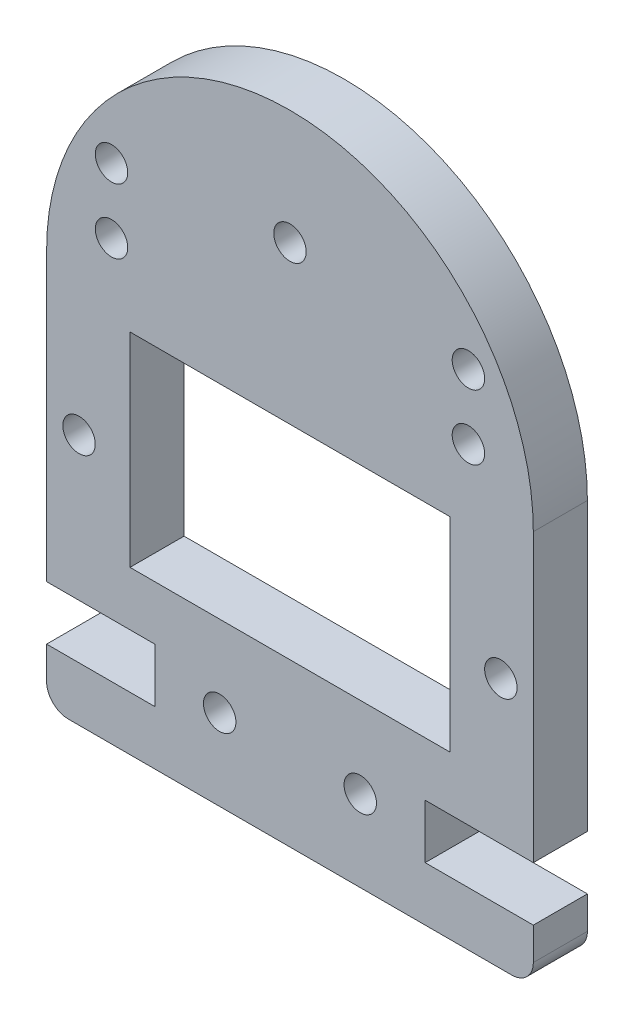
ISO-10303-21;
HEADER;
FILE_DESCRIPTION(('STEP AP214'),'2;1');
FILE_NAME('part.step','',(''),(''),'','','');
FILE_SCHEMA(('AUTOMOTIVE_DESIGN { 1 0 10303 214 1 1 1 1 }'));
ENDSEC;
DATA;
#1=APPLICATION_CONTEXT('core data for automotive mechanical design processes');
#2=APPLICATION_PROTOCOL_DEFINITION('international standard','automotive_design',2000,#1);
#3=PRODUCT_CONTEXT('',#1,'mechanical');
#4=PRODUCT('Part','Part','',(#3));
#5=PRODUCT_RELATED_PRODUCT_CATEGORY('part','',(#4));
#6=PRODUCT_DEFINITION_FORMATION('','',#4);
#7=PRODUCT_DEFINITION_CONTEXT('part definition',#1,'design');
#8=PRODUCT_DEFINITION('design','',#6,#7);
#9=PRODUCT_DEFINITION_SHAPE('','',#8);
#10=(LENGTH_UNIT() NAMED_UNIT(*) SI_UNIT(.MILLI.,.METRE.));
#11=(NAMED_UNIT(*) PLANE_ANGLE_UNIT() SI_UNIT($,.RADIAN.));
#12=(NAMED_UNIT(*) SI_UNIT($,.STERADIAN.) SOLID_ANGLE_UNIT());
#13=UNCERTAINTY_MEASURE_WITH_UNIT(LENGTH_MEASURE(1.E-05),#10,'distance_accuracy_value','');
#14=(GEOMETRIC_REPRESENTATION_CONTEXT(3) GLOBAL_UNCERTAINTY_ASSIGNED_CONTEXT((#13)) GLOBAL_UNIT_ASSIGNED_CONTEXT((#10,
#11,#12)) REPRESENTATION_CONTEXT('',''));
#15=CARTESIAN_POINT('',(0.,0.,0.));
#16=DIRECTION('',(0.,0.,1.));
#17=DIRECTION('',(1.,0.,0.));
#18=AXIS2_PLACEMENT_3D('',#15,#16,#17);
#19=CARTESIAN_POINT('',(-1.76634170575383,13.25,5.));
#20=DIRECTION('',(0.,0.,-1.));
#21=DIRECTION('',(-1.,0.,0.));
#22=AXIS2_PLACEMENT_3D('',#19,#20,#21);
#23=CYLINDRICAL_SURFACE('',#22,22.5);
#24=CARTESIAN_POINT('',(-1.76634170575383,13.25,0.));
#25=DIRECTION('',(0.,0.,1.));
#26=DIRECTION('',(1.,0.,0.));
#27=AXIS2_PLACEMENT_3D('',#24,#25,#26);
#28=CIRCLE('',#27,22.5);
#29=CARTESIAN_POINT('',(20.7336582942462,13.25,0.));
#30=VERTEX_POINT('',#29);
#31=CARTESIAN_POINT('',(-24.2663417057538,13.25,0.));
#32=VERTEX_POINT('',#31);
#33=EDGE_CURVE('E198',#30,#32,#28,.T.);
#34=ORIENTED_EDGE('',*,*,#33,.T.);
#35=DIRECTION('',(0.,0.,-1.));
#36=VECTOR('',#35,1.);
#37=CARTESIAN_POINT('',(-24.2663417057538,13.25,5.));
#38=LINE('',#37,#36);
#39=CARTESIAN_POINT('',(-24.2663417057538,13.25,5.));
#40=VERTEX_POINT('',#39);
#41=EDGE_CURVE('E11',#40,#32,#38,.T.);
#42=ORIENTED_EDGE('',*,*,#41,.F.);
#43=CARTESIAN_POINT('',(-1.76634170575383,13.25,5.));
#44=DIRECTION('',(0.,0.,1.));
#45=DIRECTION('',(1.,0.,0.));
#46=AXIS2_PLACEMENT_3D('',#43,#44,#45);
#47=CIRCLE('',#46,22.5);
#48=CARTESIAN_POINT('',(20.7336582942462,13.25,5.));
#49=VERTEX_POINT('',#48);
#50=EDGE_CURVE('E202',#49,#40,#47,.T.);
#51=ORIENTED_EDGE('',*,*,#50,.F.);
#52=DIRECTION('',(0.,0.,-1.));
#53=VECTOR('',#52,1.);
#54=CARTESIAN_POINT('',(20.7336582942462,13.25,5.));
#55=LINE('',#54,#53);
#56=EDGE_CURVE('E232',#49,#30,#55,.T.);
#57=ORIENTED_EDGE('',*,*,#56,.T.);
#58=EDGE_LOOP('',(#34,#42,#51,#57));
#59=FACE_BOUND('',#58,.T.);
#60=ADVANCED_FACE('F35',(#59),#23,.T.);
#61=CARTESIAN_POINT('',(-24.2663417057538,-13.25,5.));
#62=DIRECTION('',(1.,0.,0.));
#63=DIRECTION('',(0.,0.,-1.));
#64=AXIS2_PLACEMENT_3D('',#61,#62,#63);
#65=PLANE('',#64);
#66=DIRECTION('',(0.,-1.,0.));
#67=VECTOR('',#66,1.);
#68=CARTESIAN_POINT('',(-24.2663417057538,-13.25,0.));
#69=LINE('',#68,#67);
#70=CARTESIAN_POINT('',(-24.2663417057538,-13.25,0.));
#71=VERTEX_POINT('',#70);
#72=EDGE_CURVE('E235',#32,#71,#69,.T.);
#73=ORIENTED_EDGE('',*,*,#72,.T.);
#74=DIRECTION('',(0.,0.,-1.));
#75=VECTOR('',#74,1.);
#76=CARTESIAN_POINT('',(-24.2663417057538,-13.25,5.));
#77=LINE('',#76,#75);
#78=CARTESIAN_POINT('',(-24.2663417057538,-13.25,5.));
#79=VERTEX_POINT('',#78);
#80=EDGE_CURVE('E43',#79,#71,#77,.T.);
#81=ORIENTED_EDGE('',*,*,#80,.F.);
#82=DIRECTION('',(0.,-1.,0.));
#83=VECTOR('',#82,1.);
#84=CARTESIAN_POINT('',(-24.2663417057538,-3.25,5.));
#85=LINE('',#84,#83);
#86=EDGE_CURVE('E205',#40,#79,#85,.T.);
#87=ORIENTED_EDGE('',*,*,#86,.F.);
#88=ORIENTED_EDGE('',*,*,#41,.T.);
#89=EDGE_LOOP('',(#73,#81,#87,#88));
#90=FACE_BOUND('',#89,.T.);
#91=ADVANCED_FACE('F422',(#90),#65,.F.);
#92=CARTESIAN_POINT('',(-14.2663417057538,-13.25,5.));
#93=DIRECTION('',(0.,1.,0.));
#94=DIRECTION('',(0.,0.,1.));
#95=AXIS2_PLACEMENT_3D('',#92,#93,#94);
#96=PLANE('',#95);
#97=DIRECTION('',(1.,0.,0.));
#98=VECTOR('',#97,1.);
#99=CARTESIAN_POINT('',(-14.2663417057538,-13.25,0.));
#100=LINE('',#99,#98);
#101=CARTESIAN_POINT('',(-14.2663417057538,-13.25,0.));
#102=VERTEX_POINT('',#101);
#103=EDGE_CURVE('E237',#71,#102,#100,.T.);
#104=ORIENTED_EDGE('',*,*,#103,.T.);
#105=DIRECTION('',(0.,0.,-1.));
#106=VECTOR('',#105,1.);
#107=CARTESIAN_POINT('',(-14.2663417057538,-13.25,5.));
#108=LINE('',#107,#106);
#109=CARTESIAN_POINT('',(-14.2663417057538,-13.25,5.));
#110=VERTEX_POINT('',#109);
#111=EDGE_CURVE('E293',#110,#102,#108,.T.);
#112=ORIENTED_EDGE('',*,*,#111,.F.);
#113=DIRECTION('',(1.,0.,0.));
#114=VECTOR('',#113,1.);
#115=CARTESIAN_POINT('',(-14.2663417057538,-13.25,5.));
#116=LINE('',#115,#114);
#117=EDGE_CURVE('E208',#79,#110,#116,.T.);
#118=ORIENTED_EDGE('',*,*,#117,.F.);
#119=ORIENTED_EDGE('',*,*,#80,.T.);
#120=EDGE_LOOP('',(#104,#112,#118,#119));
#121=FACE_BOUND('',#120,.T.);
#122=ADVANCED_FACE('F418',(#121),#96,.F.);
#123=CARTESIAN_POINT('',(-14.2663417057538,-13.25,5.));
#124=DIRECTION('',(1.,0.,0.));
#125=DIRECTION('',(0.,0.,-1.));
#126=AXIS2_PLACEMENT_3D('',#123,#124,#125);
#127=PLANE('',#126);
#128=DIRECTION('',(0.,-1.,0.));
#129=VECTOR('',#128,1.);
#130=CARTESIAN_POINT('',(-14.2663417057538,-13.25,0.));
#131=LINE('',#130,#129);
#132=CARTESIAN_POINT('',(-14.2663417057538,-18.25,0.));
#133=VERTEX_POINT('',#132);
#134=EDGE_CURVE('E239',#102,#133,#131,.T.);
#135=ORIENTED_EDGE('',*,*,#134,.T.);
#136=DIRECTION('',(0.,0.,-1.));
#137=VECTOR('',#136,1.);
#138=CARTESIAN_POINT('',(-14.2663417057538,-18.25,5.));
#139=LINE('',#138,#137);
#140=CARTESIAN_POINT('',(-14.2663417057538,-18.25,5.));
#141=VERTEX_POINT('',#140);
#142=EDGE_CURVE('E290',#141,#133,#139,.T.);
#143=ORIENTED_EDGE('',*,*,#142,.F.);
#144=DIRECTION('',(0.,-1.,0.));
#145=VECTOR('',#144,1.);
#146=CARTESIAN_POINT('',(-14.2663417057538,-13.25,5.));
#147=LINE('',#146,#145);
#148=EDGE_CURVE('E210',#110,#141,#147,.T.);
#149=ORIENTED_EDGE('',*,*,#148,.F.);
#150=ORIENTED_EDGE('',*,*,#111,.T.);
#151=EDGE_LOOP('',(#135,#143,#149,#150));
#152=FACE_BOUND('',#151,.T.);
#153=ADVANCED_FACE('F415',(#152),#127,.F.);
#154=CARTESIAN_POINT('',(-14.2663417057538,-18.25,5.));
#155=DIRECTION('',(0.,-1.,0.));
#156=DIRECTION('',(0.,0.,-1.));
#157=AXIS2_PLACEMENT_3D('',#154,#155,#156);
#158=PLANE('',#157);
#159=DIRECTION('',(-1.,0.,0.));
#160=VECTOR('',#159,1.);
#161=CARTESIAN_POINT('',(-14.2663417057538,-18.25,0.));
#162=LINE('',#161,#160);
#163=CARTESIAN_POINT('',(-24.2663417057538,-18.25,0.));
#164=VERTEX_POINT('',#163);
#165=EDGE_CURVE('E241',#133,#164,#162,.T.);
#166=ORIENTED_EDGE('',*,*,#165,.T.);
#167=DIRECTION('',(0.,0.,-1.));
#168=VECTOR('',#167,1.);
#169=CARTESIAN_POINT('',(-24.2663417057538,-18.25,5.));
#170=LINE('',#169,#168);
#171=CARTESIAN_POINT('',(-24.2663417057538,-18.25,5.));
#172=VERTEX_POINT('',#171);
#173=EDGE_CURVE('E287',#172,#164,#170,.T.);
#174=ORIENTED_EDGE('',*,*,#173,.F.);
#175=DIRECTION('',(-1.,0.,0.));
#176=VECTOR('',#175,1.);
#177=CARTESIAN_POINT('',(-14.2663417057538,-18.25,5.));
#178=LINE('',#177,#176);
#179=EDGE_CURVE('E212',#141,#172,#178,.T.);
#180=ORIENTED_EDGE('',*,*,#179,.F.);
#181=ORIENTED_EDGE('',*,*,#142,.T.);
#182=EDGE_LOOP('',(#166,#174,#180,#181));
#183=FACE_BOUND('',#182,.T.);
#184=ADVANCED_FACE('F411',(#183),#158,.F.);
#185=CARTESIAN_POINT('',(-24.2663417057538,-18.25,5.));
#186=DIRECTION('',(1.,0.,0.));
#187=DIRECTION('',(0.,0.,-1.));
#188=AXIS2_PLACEMENT_3D('',#185,#186,#187);
#189=PLANE('',#188);
#190=DIRECTION('',(0.,-1.,0.));
#191=VECTOR('',#190,1.);
#192=CARTESIAN_POINT('',(-24.2663417057538,-18.25,0.));
#193=LINE('',#192,#191);
#194=CARTESIAN_POINT('',(-24.2663417057538,-21.25,0.));
#195=VERTEX_POINT('',#194);
#196=EDGE_CURVE('E243',#164,#195,#193,.T.);
#197=ORIENTED_EDGE('',*,*,#196,.T.);
#198=DIRECTION('',(0.,0.,-1.));
#199=VECTOR('',#198,1.);
#200=CARTESIAN_POINT('',(-24.2663417057538,-21.25,5.));
#201=LINE('',#200,#199);
#202=CARTESIAN_POINT('',(-24.2663417057538,-21.25,5.));
#203=VERTEX_POINT('',#202);
#204=EDGE_CURVE('E284',#203,#195,#201,.T.);
#205=ORIENTED_EDGE('',*,*,#204,.F.);
#206=DIRECTION('',(0.,-1.,0.));
#207=VECTOR('',#206,1.);
#208=CARTESIAN_POINT('',(-24.2663417057538,-18.25,5.));
#209=LINE('',#208,#207);
#210=EDGE_CURVE('E214',#172,#203,#209,.T.);
#211=ORIENTED_EDGE('',*,*,#210,.F.);
#212=ORIENTED_EDGE('',*,*,#173,.T.);
#213=EDGE_LOOP('',(#197,#205,#211,#212));
#214=FACE_BOUND('',#213,.T.);
#215=ADVANCED_FACE('F406',(#214),#189,.F.);
#216=CARTESIAN_POINT('',(-22.2663417057538,-21.25,5.));
#217=DIRECTION('',(0.,0.,-1.));
#218=DIRECTION('',(-1.,0.,0.));
#219=AXIS2_PLACEMENT_3D('',#216,#217,#218);
#220=CYLINDRICAL_SURFACE('',#219,2.);
#221=CARTESIAN_POINT('',(-22.2663417057538,-21.25,0.));
#222=DIRECTION('',(0.,0.,1.));
#223=DIRECTION('',(1.,0.,0.));
#224=AXIS2_PLACEMENT_3D('',#221,#222,#223);
#225=CIRCLE('',#224,2.);
#226=CARTESIAN_POINT('',(-22.2663417057538,-23.25,0.));
#227=VERTEX_POINT('',#226);
#228=EDGE_CURVE('E245',#195,#227,#225,.T.);
#229=ORIENTED_EDGE('',*,*,#228,.T.);
#230=DIRECTION('',(0.,0.,-1.));
#231=VECTOR('',#230,1.);
#232=CARTESIAN_POINT('',(-22.2663417057538,-23.25,5.));
#233=LINE('',#232,#231);
#234=CARTESIAN_POINT('',(-22.2663417057538,-23.25,5.));
#235=VERTEX_POINT('',#234);
#236=EDGE_CURVE('E281',#235,#227,#233,.T.);
#237=ORIENTED_EDGE('',*,*,#236,.F.);
#238=CARTESIAN_POINT('',(-22.2663417057538,-21.25,5.));
#239=DIRECTION('',(0.,0.,1.));
#240=DIRECTION('',(1.,0.,0.));
#241=AXIS2_PLACEMENT_3D('',#238,#239,#240);
#242=CIRCLE('',#241,2.);
#243=EDGE_CURVE('E216',#203,#235,#242,.T.);
#244=ORIENTED_EDGE('',*,*,#243,.F.);
#245=ORIENTED_EDGE('',*,*,#204,.T.);
#246=EDGE_LOOP('',(#229,#237,#244,#245));
#247=FACE_BOUND('',#246,.T.);
#248=ADVANCED_FACE('F400',(#247),#220,.T.);
#249=CARTESIAN_POINT('',(18.7336582942462,-23.25,5.));
#250=DIRECTION('',(0.,1.,0.));
#251=DIRECTION('',(0.,0.,1.));
#252=AXIS2_PLACEMENT_3D('',#249,#250,#251);
#253=PLANE('',#252);
#254=DIRECTION('',(1.,0.,0.));
#255=VECTOR('',#254,1.);
#256=CARTESIAN_POINT('',(18.7336582942462,-23.25,0.));
#257=LINE('',#256,#255);
#258=CARTESIAN_POINT('',(18.7336582942462,-23.25,0.));
#259=VERTEX_POINT('',#258);
#260=EDGE_CURVE('E247',#227,#259,#257,.T.);
#261=ORIENTED_EDGE('',*,*,#260,.T.);
#262=DIRECTION('',(0.,0.,-1.));
#263=VECTOR('',#262,1.);
#264=CARTESIAN_POINT('',(18.7336582942462,-23.25,5.));
#265=LINE('',#264,#263);
#266=CARTESIAN_POINT('',(18.7336582942462,-23.25,5.));
#267=VERTEX_POINT('',#266);
#268=EDGE_CURVE('E278',#267,#259,#265,.T.);
#269=ORIENTED_EDGE('',*,*,#268,.F.);
#270=DIRECTION('',(1.,0.,0.));
#271=VECTOR('',#270,1.);
#272=CARTESIAN_POINT('',(18.7336582942462,-23.25,5.));
#273=LINE('',#272,#271);
#274=EDGE_CURVE('E218',#235,#267,#273,.T.);
#275=ORIENTED_EDGE('',*,*,#274,.F.);
#276=ORIENTED_EDGE('',*,*,#236,.T.);
#277=EDGE_LOOP('',(#261,#269,#275,#276));
#278=FACE_BOUND('',#277,.T.);
#279=ADVANCED_FACE('F396',(#278),#253,.F.);
#280=CARTESIAN_POINT('',(18.7336582942462,-21.25,5.));
#281=DIRECTION('',(0.,0.,-1.));
#282=DIRECTION('',(-1.,0.,0.));
#283=AXIS2_PLACEMENT_3D('',#280,#281,#282);
#284=CYLINDRICAL_SURFACE('',#283,2.);
#285=CARTESIAN_POINT('',(18.7336582942462,-21.25,0.));
#286=DIRECTION('',(0.,0.,1.));
#287=DIRECTION('',(1.,0.,0.));
#288=AXIS2_PLACEMENT_3D('',#285,#286,#287);
#289=CIRCLE('',#288,2.);
#290=CARTESIAN_POINT('',(20.7336582942462,-21.25,0.));
#291=VERTEX_POINT('',#290);
#292=EDGE_CURVE('E249',#259,#291,#289,.T.);
#293=ORIENTED_EDGE('',*,*,#292,.T.);
#294=DIRECTION('',(0.,0.,-1.));
#295=VECTOR('',#294,1.);
#296=CARTESIAN_POINT('',(20.7336582942462,-21.25,5.));
#297=LINE('',#296,#295);
#298=CARTESIAN_POINT('',(20.7336582942462,-21.25,5.));
#299=VERTEX_POINT('',#298);
#300=EDGE_CURVE('E275',#299,#291,#297,.T.);
#301=ORIENTED_EDGE('',*,*,#300,.F.);
#302=CARTESIAN_POINT('',(18.7336582942462,-21.25,5.));
#303=DIRECTION('',(0.,0.,1.));
#304=DIRECTION('',(1.,0.,0.));
#305=AXIS2_PLACEMENT_3D('',#302,#303,#304);
#306=CIRCLE('',#305,2.);
#307=EDGE_CURVE('E220',#267,#299,#306,.T.);
#308=ORIENTED_EDGE('',*,*,#307,.F.);
#309=ORIENTED_EDGE('',*,*,#268,.T.);
#310=EDGE_LOOP('',(#293,#301,#308,#309));
#311=FACE_BOUND('',#310,.T.);
#312=ADVANCED_FACE('F391',(#311),#284,.T.);
#313=CARTESIAN_POINT('',(20.7336582942462,-18.25,5.));
#314=DIRECTION('',(-1.,0.,0.));
#315=DIRECTION('',(0.,0.,1.));
#316=AXIS2_PLACEMENT_3D('',#313,#314,#315);
#317=PLANE('',#316);
#318=DIRECTION('',(0.,1.,0.));
#319=VECTOR('',#318,1.);
#320=CARTESIAN_POINT('',(20.7336582942462,-18.25,0.));
#321=LINE('',#320,#319);
#322=CARTESIAN_POINT('',(20.7336582942462,-18.25,0.));
#323=VERTEX_POINT('',#322);
#324=EDGE_CURVE('E251',#291,#323,#321,.T.);
#325=ORIENTED_EDGE('',*,*,#324,.T.);
#326=DIRECTION('',(0.,0.,-1.));
#327=VECTOR('',#326,1.);
#328=CARTESIAN_POINT('',(20.7336582942462,-18.25,5.));
#329=LINE('',#328,#327);
#330=CARTESIAN_POINT('',(20.7336582942462,-18.25,5.));
#331=VERTEX_POINT('',#330);
#332=EDGE_CURVE('E272',#331,#323,#329,.T.);
#333=ORIENTED_EDGE('',*,*,#332,.F.);
#334=DIRECTION('',(0.,1.,0.));
#335=VECTOR('',#334,1.);
#336=CARTESIAN_POINT('',(20.7336582942462,-18.25,5.));
#337=LINE('',#336,#335);
#338=EDGE_CURVE('E222',#299,#331,#337,.T.);
#339=ORIENTED_EDGE('',*,*,#338,.F.);
#340=ORIENTED_EDGE('',*,*,#300,.T.);
#341=EDGE_LOOP('',(#325,#333,#339,#340));
#342=FACE_BOUND('',#341,.T.);
#343=ADVANCED_FACE('F385',(#342),#317,.F.);
#344=CARTESIAN_POINT('',(10.7336582942462,-18.25,5.));
#345=DIRECTION('',(0.,-1.,0.));
#346=DIRECTION('',(0.,0.,-1.));
#347=AXIS2_PLACEMENT_3D('',#344,#345,#346);
#348=PLANE('',#347);
#349=DIRECTION('',(-1.,0.,0.));
#350=VECTOR('',#349,1.);
#351=CARTESIAN_POINT('',(10.7336582942462,-18.25,0.));
#352=LINE('',#351,#350);
#353=CARTESIAN_POINT('',(10.7336582942462,-18.25,0.));
#354=VERTEX_POINT('',#353);
#355=EDGE_CURVE('E253',#323,#354,#352,.T.);
#356=ORIENTED_EDGE('',*,*,#355,.T.);
#357=DIRECTION('',(0.,0.,-1.));
#358=VECTOR('',#357,1.);
#359=CARTESIAN_POINT('',(10.7336582942462,-18.25,5.));
#360=LINE('',#359,#358);
#361=CARTESIAN_POINT('',(10.7336582942462,-18.25,5.));
#362=VERTEX_POINT('',#361);
#363=EDGE_CURVE('E269',#362,#354,#360,.T.);
#364=ORIENTED_EDGE('',*,*,#363,.F.);
#365=DIRECTION('',(-1.,0.,0.));
#366=VECTOR('',#365,1.);
#367=CARTESIAN_POINT('',(10.7336582942462,-18.25,5.));
#368=LINE('',#367,#366);
#369=EDGE_CURVE('E224',#331,#362,#368,.T.);
#370=ORIENTED_EDGE('',*,*,#369,.F.);
#371=ORIENTED_EDGE('',*,*,#332,.T.);
#372=EDGE_LOOP('',(#356,#364,#370,#371));
#373=FACE_BOUND('',#372,.T.);
#374=ADVANCED_FACE('F381',(#373),#348,.F.);
#375=CARTESIAN_POINT('',(10.7336582942462,-13.25,5.));
#376=DIRECTION('',(-1.,0.,0.));
#377=DIRECTION('',(0.,-1.,0.));
#378=AXIS2_PLACEMENT_3D('',#375,#376,#377);
#379=PLANE('',#378);
#380=DIRECTION('',(0.,1.,0.));
#381=VECTOR('',#380,1.);
#382=CARTESIAN_POINT('',(10.7336582942462,-13.25,0.));
#383=LINE('',#382,#381);
#384=CARTESIAN_POINT('',(10.7336582942462,-13.25,0.));
#385=VERTEX_POINT('',#384);
#386=EDGE_CURVE('E255',#354,#385,#383,.T.);
#387=ORIENTED_EDGE('',*,*,#386,.T.);
#388=DIRECTION('',(0.,0.,-1.));
#389=VECTOR('',#388,1.);
#390=CARTESIAN_POINT('',(10.7336582942462,-13.25,5.));
#391=LINE('',#390,#389);
#392=CARTESIAN_POINT('',(10.7336582942462,-13.25,5.));
#393=VERTEX_POINT('',#392);
#394=EDGE_CURVE('E266',#393,#385,#391,.T.);
#395=ORIENTED_EDGE('',*,*,#394,.F.);
#396=DIRECTION('',(0.,1.,0.));
#397=VECTOR('',#396,1.);
#398=CARTESIAN_POINT('',(10.7336582942462,-13.25,5.));
#399=LINE('',#398,#397);
#400=EDGE_CURVE('E226',#362,#393,#399,.T.);
#401=ORIENTED_EDGE('',*,*,#400,.F.);
#402=ORIENTED_EDGE('',*,*,#363,.T.);
#403=EDGE_LOOP('',(#387,#395,#401,#402));
#404=FACE_BOUND('',#403,.T.);
#405=ADVANCED_FACE('F376',(#404),#379,.F.);
#406=CARTESIAN_POINT('',(10.7336582942462,-13.25,5.));
#407=DIRECTION('',(0.,1.,0.));
#408=DIRECTION('',(0.,0.,1.));
#409=AXIS2_PLACEMENT_3D('',#406,#407,#408);
#410=PLANE('',#409);
#411=DIRECTION('',(1.,0.,0.));
#412=VECTOR('',#411,1.);
#413=CARTESIAN_POINT('',(10.7336582942462,-13.25,0.));
#414=LINE('',#413,#412);
#415=CARTESIAN_POINT('',(20.7336582942462,-13.25,0.));
#416=VERTEX_POINT('',#415);
#417=EDGE_CURVE('E257',#385,#416,#414,.T.);
#418=ORIENTED_EDGE('',*,*,#417,.T.);
#419=DIRECTION('',(0.,0.,-1.));
#420=VECTOR('',#419,1.);
#421=CARTESIAN_POINT('',(20.7336582942462,-13.25,5.));
#422=LINE('',#421,#420);
#423=CARTESIAN_POINT('',(20.7336582942462,-13.25,5.));
#424=VERTEX_POINT('',#423);
#425=EDGE_CURVE('E263',#424,#416,#422,.T.);
#426=ORIENTED_EDGE('',*,*,#425,.F.);
#427=DIRECTION('',(1.,0.,0.));
#428=VECTOR('',#427,1.);
#429=CARTESIAN_POINT('',(10.7336582942462,-13.25,5.));
#430=LINE('',#429,#428);
#431=EDGE_CURVE('E228',#393,#424,#430,.T.);
#432=ORIENTED_EDGE('',*,*,#431,.F.);
#433=ORIENTED_EDGE('',*,*,#394,.T.);
#434=EDGE_LOOP('',(#418,#426,#432,#433));
#435=FACE_BOUND('',#434,.T.);
#436=ADVANCED_FACE('F370',(#435),#410,.F.);
#437=CARTESIAN_POINT('',(20.7336582942462,-3.22226862184038,5.));
#438=DIRECTION('',(-1.,0.,0.));
#439=DIRECTION('',(0.,0.,1.));
#440=AXIS2_PLACEMENT_3D('',#437,#438,#439);
#441=PLANE('',#440);
#442=DIRECTION('',(0.,1.,0.));
#443=VECTOR('',#442,1.);
#444=CARTESIAN_POINT('',(20.7336582942462,-3.22226862184038,0.));
#445=LINE('',#444,#443);
#446=EDGE_CURVE('E206',#416,#30,#445,.T.);
#447=ORIENTED_EDGE('',*,*,#446,.T.);
#448=ORIENTED_EDGE('',*,*,#56,.F.);
#449=DIRECTION('',(0.,1.,0.));
#450=VECTOR('',#449,1.);
#451=CARTESIAN_POINT('',(20.7336582942462,-13.25,5.));
#452=LINE('',#451,#450);
#453=EDGE_CURVE('E230',#424,#49,#452,.T.);
#454=ORIENTED_EDGE('',*,*,#453,.F.);
#455=ORIENTED_EDGE('',*,*,#425,.T.);
#456=EDGE_LOOP('',(#447,#448,#454,#455));
#457=FACE_BOUND('',#456,.T.);
#458=ADVANCED_FACE('F366',(#457),#441,.F.);
#459=CARTESIAN_POINT('',(-1.76634170575383,13.25,5.));
#460=DIRECTION('',(0.,0.,1.));
#461=DIRECTION('',(1.,0.,0.));
#462=AXIS2_PLACEMENT_3D('',#459,#460,#461);
#463=PLANE('',#462);
#464=CARTESIAN_POINT('',(14.7336582942462,23.25,5.));
#465=DIRECTION('',(0.,0.,1.));
#466=DIRECTION('',(1.,0.,0.));
#467=AXIS2_PLACEMENT_3D('',#464,#465,#466);
#468=CIRCLE('',#467,1.5);
#469=CARTESIAN_POINT('',(16.2336582942462,23.25,5.));
#470=VERTEX_POINT('',#469);
#471=EDGE_CURVE('E318',#470,#470,#468,.T.);
#472=ORIENTED_EDGE('',*,*,#471,.F.);
#473=EDGE_LOOP('',(#472));
#474=FACE_BOUND('',#473,.T.);
#475=CARTESIAN_POINT('',(-18.2663417057538,23.25,5.));
#476=DIRECTION('',(0.,0.,1.));
#477=DIRECTION('',(1.,0.,0.));
#478=AXIS2_PLACEMENT_3D('',#475,#476,#477);
#479=CIRCLE('',#478,1.5);
#480=CARTESIAN_POINT('',(-16.7663417057538,23.25,5.));
#481=VERTEX_POINT('',#480);
#482=EDGE_CURVE('E608',#481,#481,#479,.T.);
#483=ORIENTED_EDGE('',*,*,#482,.F.);
#484=EDGE_LOOP('',(#483));
#485=FACE_BOUND('',#484,.T.);
#486=CARTESIAN_POINT('',(-18.2663417057538,17.25,5.));
#487=DIRECTION('',(0.,0.,1.));
#488=DIRECTION('',(1.,0.,0.));
#489=AXIS2_PLACEMENT_3D('',#486,#487,#488);
#490=CIRCLE('',#489,1.5);
#491=CARTESIAN_POINT('',(-16.7663417057538,17.25,5.));
#492=VERTEX_POINT('',#491);
#493=EDGE_CURVE('E331',#492,#492,#490,.T.);
#494=ORIENTED_EDGE('',*,*,#493,.F.);
#495=EDGE_LOOP('',(#494));
#496=FACE_BOUND('',#495,.T.);
#497=CARTESIAN_POINT('',(14.7336582942462,17.25,5.));
#498=DIRECTION('',(0.,0.,1.));
#499=DIRECTION('',(1.,0.,0.));
#500=AXIS2_PLACEMENT_3D('',#497,#498,#499);
#501=CIRCLE('',#500,1.5);
#502=CARTESIAN_POINT('',(16.2336582942462,17.25,5.));
#503=VERTEX_POINT('',#502);
#504=EDGE_CURVE('E314',#503,#503,#501,.T.);
#505=ORIENTED_EDGE('',*,*,#504,.F.);
#506=EDGE_LOOP('',(#505));
#507=FACE_BOUND('',#506,.T.);
#508=CARTESIAN_POINT('',(-1.76634170575383,25.15,5.));
#509=DIRECTION('',(0.,0.,1.));
#510=DIRECTION('',(1.,0.,0.));
#511=AXIS2_PLACEMENT_3D('',#508,#509,#510);
#512=CIRCLE('',#511,1.5);
#513=CARTESIAN_POINT('',(-0.266341705753831,25.15,5.));
#514=VERTEX_POINT('',#513);
#515=EDGE_CURVE('E310',#514,#514,#512,.T.);
#516=ORIENTED_EDGE('',*,*,#515,.F.);
#517=EDGE_LOOP('',(#516));
#518=FACE_BOUND('',#517,.T.);
#519=CARTESIAN_POINT('',(-8.26634170575383,-15.75,5.));
#520=DIRECTION('',(0.,0.,1.));
#521=DIRECTION('',(1.,0.,0.));
#522=AXIS2_PLACEMENT_3D('',#519,#520,#521);
#523=CIRCLE('',#522,1.5);
#524=CARTESIAN_POINT('',(-6.76634170575383,-15.75,5.));
#525=VERTEX_POINT('',#524);
#526=EDGE_CURVE('E306',#525,#525,#523,.T.);
#527=ORIENTED_EDGE('',*,*,#526,.F.);
#528=EDGE_LOOP('',(#527));
#529=FACE_BOUND('',#528,.T.);
#530=CARTESIAN_POINT('',(4.73365829424617,-15.75,5.));
#531=DIRECTION('',(0.,0.,1.));
#532=DIRECTION('',(1.,0.,0.));
#533=AXIS2_PLACEMENT_3D('',#530,#531,#532);
#534=CIRCLE('',#533,1.5);
#535=CARTESIAN_POINT('',(6.23365829424617,-15.75,5.));
#536=VERTEX_POINT('',#535);
#537=EDGE_CURVE('E302',#536,#536,#534,.T.);
#538=ORIENTED_EDGE('',*,*,#537,.F.);
#539=EDGE_LOOP('',(#538));
#540=FACE_BOUND('',#539,.T.);
#541=CARTESIAN_POINT('',(-21.2663417057538,0.,5.));
#542=DIRECTION('',(0.,0.,-1.));
#543=DIRECTION('',(-1.,0.,0.));
#544=AXIS2_PLACEMENT_3D('',#541,#542,#543);
#545=CIRCLE('',#544,1.5);
#546=CARTESIAN_POINT('',(-22.7663417057538,0.,5.));
#547=VERTEX_POINT('',#546);
#548=EDGE_CURVE('E339',#547,#547,#545,.T.);
#549=ORIENTED_EDGE('',*,*,#548,.T.);
#550=EDGE_LOOP('',(#549));
#551=FACE_BOUND('',#550,.T.);
#552=CARTESIAN_POINT('',(17.7336582942462,0.,5.));
#553=DIRECTION('',(0.,0.,-1.));
#554=DIRECTION('',(-1.,0.,0.));
#555=AXIS2_PLACEMENT_3D('',#552,#553,#554);
#556=CIRCLE('',#555,1.5);
#557=CARTESIAN_POINT('',(16.2336582942462,0.,5.));
#558=VERTEX_POINT('',#557);
#559=EDGE_CURVE('E192',#558,#558,#556,.T.);
#560=ORIENTED_EDGE('',*,*,#559,.T.);
#561=EDGE_LOOP('',(#560));
#562=FACE_BOUND('',#561,.T.);
#563=DIRECTION('',(0.,1.,0.));
#564=VECTOR('',#563,1.);
#565=CARTESIAN_POINT('',(-16.5563417057538,-8.25,5.));
#566=LINE('',#565,#564);
#567=CARTESIAN_POINT('',(-16.5563417057538,-8.25,5.));
#568=VERTEX_POINT('',#567);
#569=CARTESIAN_POINT('',(-16.5563417057538,10.6,5.));
#570=VERTEX_POINT('',#569);
#571=EDGE_CURVE('E163',#568,#570,#566,.T.);
#572=ORIENTED_EDGE('',*,*,#571,.T.);
#573=DIRECTION('',(1.,0.,0.));
#574=VECTOR('',#573,1.);
#575=CARTESIAN_POINT('',(-16.5563417057538,10.6,5.));
#576=LINE('',#575,#574);
#577=CARTESIAN_POINT('',(13.0236582942462,10.6,5.));
#578=VERTEX_POINT('',#577);
#579=EDGE_CURVE('E172',#570,#578,#576,.T.);
#580=ORIENTED_EDGE('',*,*,#579,.T.);
#581=DIRECTION('',(0.,-1.,0.));
#582=VECTOR('',#581,1.);
#583=CARTESIAN_POINT('',(13.0236582942462,-8.25,5.));
#584=LINE('',#583,#582);
#585=CARTESIAN_POINT('',(13.0236582942462,-8.25,5.));
#586=VERTEX_POINT('',#585);
#587=EDGE_CURVE('E51',#578,#586,#584,.T.);
#588=ORIENTED_EDGE('',*,*,#587,.T.);
#589=DIRECTION('',(-1.,0.,0.));
#590=VECTOR('',#589,1.);
#591=CARTESIAN_POINT('',(-16.5563417057538,-8.25,5.));
#592=LINE('',#591,#590);
#593=EDGE_CURVE('E169',#586,#568,#592,.T.);
#594=ORIENTED_EDGE('',*,*,#593,.T.);
#595=EDGE_LOOP('',(#572,#580,#588,#594));
#596=FACE_BOUND('',#595,.T.);
#597=ORIENTED_EDGE('',*,*,#50,.T.);
#598=ORIENTED_EDGE('',*,*,#86,.T.);
#599=ORIENTED_EDGE('',*,*,#117,.T.);
#600=ORIENTED_EDGE('',*,*,#148,.T.);
#601=ORIENTED_EDGE('',*,*,#179,.T.);
#602=ORIENTED_EDGE('',*,*,#210,.T.);
#603=ORIENTED_EDGE('',*,*,#243,.T.);
#604=ORIENTED_EDGE('',*,*,#274,.T.);
#605=ORIENTED_EDGE('',*,*,#307,.T.);
#606=ORIENTED_EDGE('',*,*,#338,.T.);
#607=ORIENTED_EDGE('',*,*,#369,.T.);
#608=ORIENTED_EDGE('',*,*,#400,.T.);
#609=ORIENTED_EDGE('',*,*,#431,.T.);
#610=ORIENTED_EDGE('',*,*,#453,.T.);
#611=EDGE_LOOP('',(#597,#598,#599,#600,#601,#602,#603,#604,#605,#606,#607,#608,#609,#610));
#612=FACE_BOUND('',#611,.T.);
#613=ADVANCED_FACE('F176',(#474,#485,#496,#507,#518,#529,#540,#551,#562,#596,#612),#463,.T.);
#614=CARTESIAN_POINT('',(-1.76634170575383,13.25,0.));
#615=DIRECTION('',(0.,0.,1.));
#616=DIRECTION('',(1.,0.,0.));
#617=AXIS2_PLACEMENT_3D('',#614,#615,#616);
#618=PLANE('',#617);
#619=CARTESIAN_POINT('',(14.7336582942462,23.25,0.));
#620=DIRECTION('',(0.,0.,1.));
#621=DIRECTION('',(1.,0.,0.));
#622=AXIS2_PLACEMENT_3D('',#619,#620,#621);
#623=CIRCLE('',#622,1.5);
#624=CARTESIAN_POINT('',(16.2336582942462,23.25,0.));
#625=VERTEX_POINT('',#624);
#626=EDGE_CURVE('E38',#625,#625,#623,.T.);
#627=ORIENTED_EDGE('',*,*,#626,.T.);
#628=EDGE_LOOP('',(#627));
#629=FACE_BOUND('',#628,.T.);
#630=CARTESIAN_POINT('',(-18.2663417057538,23.25,0.));
#631=DIRECTION('',(0.,0.,1.));
#632=DIRECTION('',(1.,0.,0.));
#633=AXIS2_PLACEMENT_3D('',#630,#631,#632);
#634=CIRCLE('',#633,1.5);
#635=CARTESIAN_POINT('',(-16.7663417057538,23.25,0.));
#636=VERTEX_POINT('',#635);
#637=EDGE_CURVE('E317',#636,#636,#634,.T.);
#638=ORIENTED_EDGE('',*,*,#637,.T.);
#639=EDGE_LOOP('',(#638));
#640=FACE_BOUND('',#639,.T.);
#641=CARTESIAN_POINT('',(-18.2663417057538,17.25,0.));
#642=DIRECTION('',(0.,0.,1.));
#643=DIRECTION('',(1.,0.,0.));
#644=AXIS2_PLACEMENT_3D('',#641,#642,#643);
#645=CIRCLE('',#644,1.5);
#646=CARTESIAN_POINT('',(-16.7663417057538,17.25,0.));
#647=VERTEX_POINT('',#646);
#648=EDGE_CURVE('E315',#647,#647,#645,.T.);
#649=ORIENTED_EDGE('',*,*,#648,.T.);
#650=EDGE_LOOP('',(#649));
#651=FACE_BOUND('',#650,.T.);
#652=CARTESIAN_POINT('',(14.7336582942462,17.25,0.));
#653=DIRECTION('',(0.,0.,1.));
#654=DIRECTION('',(1.,0.,0.));
#655=AXIS2_PLACEMENT_3D('',#652,#653,#654);
#656=CIRCLE('',#655,1.5);
#657=CARTESIAN_POINT('',(16.2336582942462,17.25,0.));
#658=VERTEX_POINT('',#657);
#659=EDGE_CURVE('E311',#658,#658,#656,.T.);
#660=ORIENTED_EDGE('',*,*,#659,.T.);
#661=EDGE_LOOP('',(#660));
#662=FACE_BOUND('',#661,.T.);
#663=CARTESIAN_POINT('',(-1.76634170575383,25.15,0.));
#664=DIRECTION('',(0.,0.,1.));
#665=DIRECTION('',(1.,0.,0.));
#666=AXIS2_PLACEMENT_3D('',#663,#664,#665);
#667=CIRCLE('',#666,1.5);
#668=CARTESIAN_POINT('',(-0.266341705753831,25.15,0.));
#669=VERTEX_POINT('',#668);
#670=EDGE_CURVE('E307',#669,#669,#667,.T.);
#671=ORIENTED_EDGE('',*,*,#670,.T.);
#672=EDGE_LOOP('',(#671));
#673=FACE_BOUND('',#672,.T.);
#674=CARTESIAN_POINT('',(-8.26634170575383,-15.75,0.));
#675=DIRECTION('',(0.,0.,1.));
#676=DIRECTION('',(1.,0.,0.));
#677=AXIS2_PLACEMENT_3D('',#674,#675,#676);
#678=CIRCLE('',#677,1.5);
#679=CARTESIAN_POINT('',(-6.76634170575383,-15.75,0.));
#680=VERTEX_POINT('',#679);
#681=EDGE_CURVE('E303',#680,#680,#678,.T.);
#682=ORIENTED_EDGE('',*,*,#681,.T.);
#683=EDGE_LOOP('',(#682));
#684=FACE_BOUND('',#683,.T.);
#685=CARTESIAN_POINT('',(4.73365829424617,-15.75,0.));
#686=DIRECTION('',(0.,0.,1.));
#687=DIRECTION('',(1.,0.,0.));
#688=AXIS2_PLACEMENT_3D('',#685,#686,#687);
#689=CIRCLE('',#688,1.5);
#690=CARTESIAN_POINT('',(6.23365829424617,-15.75,0.));
#691=VERTEX_POINT('',#690);
#692=EDGE_CURVE('E298',#691,#691,#689,.T.);
#693=ORIENTED_EDGE('',*,*,#692,.T.);
#694=EDGE_LOOP('',(#693));
#695=FACE_BOUND('',#694,.T.);
#696=CARTESIAN_POINT('',(-21.2663417057538,0.,0.));
#697=DIRECTION('',(0.,0.,-1.));
#698=DIRECTION('',(-1.,0.,0.));
#699=AXIS2_PLACEMENT_3D('',#696,#697,#698);
#700=CIRCLE('',#699,1.5);
#701=CARTESIAN_POINT('',(-22.7663417057538,0.,0.));
#702=VERTEX_POINT('',#701);
#703=EDGE_CURVE('E301',#702,#702,#700,.T.);
#704=ORIENTED_EDGE('',*,*,#703,.F.);
#705=EDGE_LOOP('',(#704));
#706=FACE_BOUND('',#705,.T.);
#707=CARTESIAN_POINT('',(17.7336582942462,0.,0.));
#708=DIRECTION('',(0.,0.,-1.));
#709=DIRECTION('',(-1.,0.,0.));
#710=AXIS2_PLACEMENT_3D('',#707,#708,#709);
#711=CIRCLE('',#710,1.5);
#712=CARTESIAN_POINT('',(16.2336582942462,0.,0.));
#713=VERTEX_POINT('',#712);
#714=EDGE_CURVE('E185',#713,#713,#711,.T.);
#715=ORIENTED_EDGE('',*,*,#714,.F.);
#716=EDGE_LOOP('',(#715));
#717=FACE_BOUND('',#716,.T.);
#718=DIRECTION('',(1.,0.,0.));
#719=VECTOR('',#718,1.);
#720=CARTESIAN_POINT('',(-16.5563417057538,10.6,0.));
#721=LINE('',#720,#719);
#722=CARTESIAN_POINT('',(-16.5563417057538,10.6,0.));
#723=VERTEX_POINT('',#722);
#724=CARTESIAN_POINT('',(13.0236582942462,10.6,0.));
#725=VERTEX_POINT('',#724);
#726=EDGE_CURVE('E191',#723,#725,#721,.T.);
#727=ORIENTED_EDGE('',*,*,#726,.F.);
#728=DIRECTION('',(0.,1.,0.));
#729=VECTOR('',#728,1.);
#730=CARTESIAN_POINT('',(-16.5563417057538,-8.25,0.));
#731=LINE('',#730,#729);
#732=CARTESIAN_POINT('',(-16.5563417057538,-8.25,0.));
#733=VERTEX_POINT('',#732);
#734=EDGE_CURVE('E59',#733,#723,#731,.T.);
#735=ORIENTED_EDGE('',*,*,#734,.F.);
#736=DIRECTION('',(-1.,0.,0.));
#737=VECTOR('',#736,1.);
#738=CARTESIAN_POINT('',(-16.5563417057538,-8.25,0.));
#739=LINE('',#738,#737);
#740=CARTESIAN_POINT('',(13.0236582942462,-8.25,0.));
#741=VERTEX_POINT('',#740);
#742=EDGE_CURVE('E179',#741,#733,#739,.T.);
#743=ORIENTED_EDGE('',*,*,#742,.F.);
#744=DIRECTION('',(0.,-1.,0.));
#745=VECTOR('',#744,1.);
#746=CARTESIAN_POINT('',(13.0236582942462,-8.25,0.));
#747=LINE('',#746,#745);
#748=EDGE_CURVE('E182',#725,#741,#747,.T.);
#749=ORIENTED_EDGE('',*,*,#748,.F.);
#750=EDGE_LOOP('',(#727,#735,#743,#749));
#751=FACE_BOUND('',#750,.T.);
#752=ORIENTED_EDGE('',*,*,#33,.F.);
#753=ORIENTED_EDGE('',*,*,#446,.F.);
#754=ORIENTED_EDGE('',*,*,#417,.F.);
#755=ORIENTED_EDGE('',*,*,#386,.F.);
#756=ORIENTED_EDGE('',*,*,#355,.F.);
#757=ORIENTED_EDGE('',*,*,#324,.F.);
#758=ORIENTED_EDGE('',*,*,#292,.F.);
#759=ORIENTED_EDGE('',*,*,#260,.F.);
#760=ORIENTED_EDGE('',*,*,#228,.F.);
#761=ORIENTED_EDGE('',*,*,#196,.F.);
#762=ORIENTED_EDGE('',*,*,#165,.F.);
#763=ORIENTED_EDGE('',*,*,#134,.F.);
#764=ORIENTED_EDGE('',*,*,#103,.F.);
#765=ORIENTED_EDGE('',*,*,#72,.F.);
#766=EDGE_LOOP('',(#752,#753,#754,#755,#756,#757,#758,#759,#760,#761,#762,#763,#764,#765));
#767=FACE_BOUND('',#766,.T.);
#768=ADVANCED_FACE('F351',(#629,#640,#651,#662,#673,#684,#695,#706,#717,#751,#767),#618,.F.);
#769=CARTESIAN_POINT('',(-16.5563417057538,-8.25,5.));
#770=DIRECTION('',(-1.,0.,0.));
#771=DIRECTION('',(0.,0.,1.));
#772=AXIS2_PLACEMENT_3D('',#769,#770,#771);
#773=PLANE('',#772);
#774=ORIENTED_EDGE('',*,*,#734,.T.);
#775=DIRECTION('',(0.,0.,-1.));
#776=VECTOR('',#775,1.);
#777=CARTESIAN_POINT('',(-16.5563417057538,10.6,5.));
#778=LINE('',#777,#776);
#779=EDGE_CURVE('E159',#570,#723,#778,.T.);
#780=ORIENTED_EDGE('',*,*,#779,.F.);
#781=ORIENTED_EDGE('',*,*,#571,.F.);
#782=DIRECTION('',(0.,0.,-1.));
#783=VECTOR('',#782,1.);
#784=CARTESIAN_POINT('',(-16.5563417057538,-8.25,5.));
#785=LINE('',#784,#783);
#786=EDGE_CURVE('E196',#568,#733,#785,.T.);
#787=ORIENTED_EDGE('',*,*,#786,.T.);
#788=EDGE_LOOP('',(#774,#780,#781,#787));
#789=FACE_BOUND('',#788,.T.);
#790=ADVANCED_FACE('F161',(#789),#773,.F.);
#791=CARTESIAN_POINT('',(-16.5563417057538,-8.25,5.));
#792=DIRECTION('',(0.,-1.,0.));
#793=DIRECTION('',(1.,0.,0.));
#794=AXIS2_PLACEMENT_3D('',#791,#792,#793);
#795=PLANE('',#794);
#796=ORIENTED_EDGE('',*,*,#742,.T.);
#797=ORIENTED_EDGE('',*,*,#786,.F.);
#798=ORIENTED_EDGE('',*,*,#593,.F.);
#799=DIRECTION('',(0.,0.,-1.));
#800=VECTOR('',#799,1.);
#801=CARTESIAN_POINT('',(13.0236582942462,-8.25,5.));
#802=LINE('',#801,#800);
#803=EDGE_CURVE('E199',#586,#741,#802,.T.);
#804=ORIENTED_EDGE('',*,*,#803,.T.);
#805=EDGE_LOOP('',(#796,#797,#798,#804));
#806=FACE_BOUND('',#805,.T.);
#807=ADVANCED_FACE('F480',(#806),#795,.F.);
#808=CARTESIAN_POINT('',(13.0236582942462,-8.25,5.));
#809=DIRECTION('',(1.,0.,0.));
#810=DIRECTION('',(0.,1.,0.));
#811=AXIS2_PLACEMENT_3D('',#808,#809,#810);
#812=PLANE('',#811);
#813=ORIENTED_EDGE('',*,*,#748,.T.);
#814=ORIENTED_EDGE('',*,*,#803,.F.);
#815=ORIENTED_EDGE('',*,*,#587,.F.);
#816=DIRECTION('',(0.,0.,-1.));
#817=VECTOR('',#816,1.);
#818=CARTESIAN_POINT('',(13.0236582942462,10.6,5.));
#819=LINE('',#818,#817);
#820=EDGE_CURVE('E168',#578,#725,#819,.T.);
#821=ORIENTED_EDGE('',*,*,#820,.T.);
#822=EDGE_LOOP('',(#813,#814,#815,#821));
#823=FACE_BOUND('',#822,.T.);
#824=ADVANCED_FACE('F489',(#823),#812,.F.);
#825=CARTESIAN_POINT('',(-16.5563417057538,10.6,5.));
#826=DIRECTION('',(0.,1.,0.));
#827=DIRECTION('',(-1.,0.,0.));
#828=AXIS2_PLACEMENT_3D('',#825,#826,#827);
#829=PLANE('',#828);
#830=ORIENTED_EDGE('',*,*,#726,.T.);
#831=ORIENTED_EDGE('',*,*,#820,.F.);
#832=ORIENTED_EDGE('',*,*,#579,.F.);
#833=ORIENTED_EDGE('',*,*,#779,.T.);
#834=EDGE_LOOP('',(#830,#831,#832,#833));
#835=FACE_BOUND('',#834,.T.);
#836=ADVANCED_FACE('F173',(#835),#829,.F.);
#837=CARTESIAN_POINT('',(17.7336582942462,0.,5.));
#838=DIRECTION('',(0.,0.,-1.));
#839=DIRECTION('',(-1.,0.,0.));
#840=AXIS2_PLACEMENT_3D('',#837,#838,#839);
#841=CYLINDRICAL_SURFACE('',#840,1.5);
#842=ORIENTED_EDGE('',*,*,#559,.F.);
#843=EDGE_LOOP('',(#842));
#844=FACE_BOUND('',#843,.T.);
#845=ORIENTED_EDGE('',*,*,#714,.T.);
#846=EDGE_LOOP('',(#845));
#847=FACE_BOUND('',#846,.T.);
#848=ADVANCED_FACE('F349',(#844,#847),#841,.F.);
#849=CARTESIAN_POINT('',(-21.2663417057538,0.,5.));
#850=DIRECTION('',(0.,0.,-1.));
#851=DIRECTION('',(-1.,0.,0.));
#852=AXIS2_PLACEMENT_3D('',#849,#850,#851);
#853=CYLINDRICAL_SURFACE('',#852,1.5);
#854=ORIENTED_EDGE('',*,*,#548,.F.);
#855=EDGE_LOOP('',(#854));
#856=FACE_BOUND('',#855,.T.);
#857=ORIENTED_EDGE('',*,*,#703,.T.);
#858=EDGE_LOOP('',(#857));
#859=FACE_BOUND('',#858,.T.);
#860=ADVANCED_FACE('F515',(#856,#859),#853,.F.);
#861=CARTESIAN_POINT('',(4.73365829424617,-15.75,-5.));
#862=DIRECTION('',(0.,0.,1.));
#863=DIRECTION('',(1.,0.,0.));
#864=AXIS2_PLACEMENT_3D('',#861,#862,#863);
#865=CYLINDRICAL_SURFACE('',#864,1.5);
#866=ORIENTED_EDGE('',*,*,#537,.T.);
#867=EDGE_LOOP('',(#866));
#868=FACE_BOUND('',#867,.T.);
#869=ORIENTED_EDGE('',*,*,#692,.F.);
#870=EDGE_LOOP('',(#869));
#871=FACE_BOUND('',#870,.T.);
#872=ADVANCED_FACE('F525',(#868,#871),#865,.F.);
#873=CARTESIAN_POINT('',(-8.26634170575383,-15.75,-5.));
#874=DIRECTION('',(0.,0.,1.));
#875=DIRECTION('',(1.,0.,0.));
#876=AXIS2_PLACEMENT_3D('',#873,#874,#875);
#877=CYLINDRICAL_SURFACE('',#876,1.5);
#878=ORIENTED_EDGE('',*,*,#526,.T.);
#879=EDGE_LOOP('',(#878));
#880=FACE_BOUND('',#879,.T.);
#881=ORIENTED_EDGE('',*,*,#681,.F.);
#882=EDGE_LOOP('',(#881));
#883=FACE_BOUND('',#882,.T.);
#884=ADVANCED_FACE('F535',(#880,#883),#877,.F.);
#885=CARTESIAN_POINT('',(-1.76634170575383,25.15,-5.));
#886=DIRECTION('',(0.,0.,1.));
#887=DIRECTION('',(1.,0.,0.));
#888=AXIS2_PLACEMENT_3D('',#885,#886,#887);
#889=CYLINDRICAL_SURFACE('',#888,1.5);
#890=ORIENTED_EDGE('',*,*,#515,.T.);
#891=EDGE_LOOP('',(#890));
#892=FACE_BOUND('',#891,.T.);
#893=ORIENTED_EDGE('',*,*,#670,.F.);
#894=EDGE_LOOP('',(#893));
#895=FACE_BOUND('',#894,.T.);
#896=ADVANCED_FACE('F545',(#892,#895),#889,.F.);
#897=CARTESIAN_POINT('',(14.7336582942462,17.25,-71.));
#898=DIRECTION('',(0.,0.,1.));
#899=DIRECTION('',(1.,0.,0.));
#900=AXIS2_PLACEMENT_3D('',#897,#898,#899);
#901=CYLINDRICAL_SURFACE('',#900,1.5);
#902=ORIENTED_EDGE('',*,*,#504,.T.);
#903=EDGE_LOOP('',(#902));
#904=FACE_BOUND('',#903,.T.);
#905=ORIENTED_EDGE('',*,*,#659,.F.);
#906=EDGE_LOOP('',(#905));
#907=FACE_BOUND('',#906,.T.);
#908=ADVANCED_FACE('F554',(#904,#907),#901,.F.);
#909=CARTESIAN_POINT('',(-18.2663417057538,17.25,-71.));
#910=DIRECTION('',(0.,0.,1.));
#911=DIRECTION('',(1.,0.,0.));
#912=AXIS2_PLACEMENT_3D('',#909,#910,#911);
#913=CYLINDRICAL_SURFACE('',#912,1.5);
#914=ORIENTED_EDGE('',*,*,#493,.T.);
#915=EDGE_LOOP('',(#914));
#916=FACE_BOUND('',#915,.T.);
#917=ORIENTED_EDGE('',*,*,#648,.F.);
#918=EDGE_LOOP('',(#917));
#919=FACE_BOUND('',#918,.T.);
#920=ADVANCED_FACE('F573',(#916,#919),#913,.F.);
#921=CARTESIAN_POINT('',(-18.2663417057538,23.25,-71.));
#922=DIRECTION('',(0.,0.,1.));
#923=DIRECTION('',(1.,0.,0.));
#924=AXIS2_PLACEMENT_3D('',#921,#922,#923);
#925=CYLINDRICAL_SURFACE('',#924,1.5);
#926=ORIENTED_EDGE('',*,*,#482,.T.);
#927=EDGE_LOOP('',(#926));
#928=FACE_BOUND('',#927,.T.);
#929=ORIENTED_EDGE('',*,*,#637,.F.);
#930=EDGE_LOOP('',(#929));
#931=FACE_BOUND('',#930,.T.);
#932=ADVANCED_FACE('F582',(#928,#931),#925,.F.);
#933=CARTESIAN_POINT('',(14.7336582942462,23.25,-71.));
#934=DIRECTION('',(0.,0.,1.));
#935=DIRECTION('',(1.,0.,0.));
#936=AXIS2_PLACEMENT_3D('',#933,#934,#935);
#937=CYLINDRICAL_SURFACE('',#936,1.5);
#938=ORIENTED_EDGE('',*,*,#471,.T.);
#939=EDGE_LOOP('',(#938));
#940=FACE_BOUND('',#939,.T.);
#941=ORIENTED_EDGE('',*,*,#626,.F.);
#942=EDGE_LOOP('',(#941));
#943=FACE_BOUND('',#942,.T.);
#944=ADVANCED_FACE('F592',(#940,#943),#937,.F.);
#945=CLOSED_SHELL('',(#60,#91,#122,#153,#184,#215,#248,#279,#312,#343,#374,#405,#436,#458,#613,
#768,#790,#807,#824,#836,#848,#860,#872,#884,#896,#908,#920,#932,#944));
#946=MANIFOLD_SOLID_BREP('B2',#945);
#947=ADVANCED_BREP_SHAPE_REPRESENTATION('',(#18,#946),#14);
#948=SHAPE_DEFINITION_REPRESENTATION(#9,#947);
ENDSEC;
END-ISO-10303-21;
